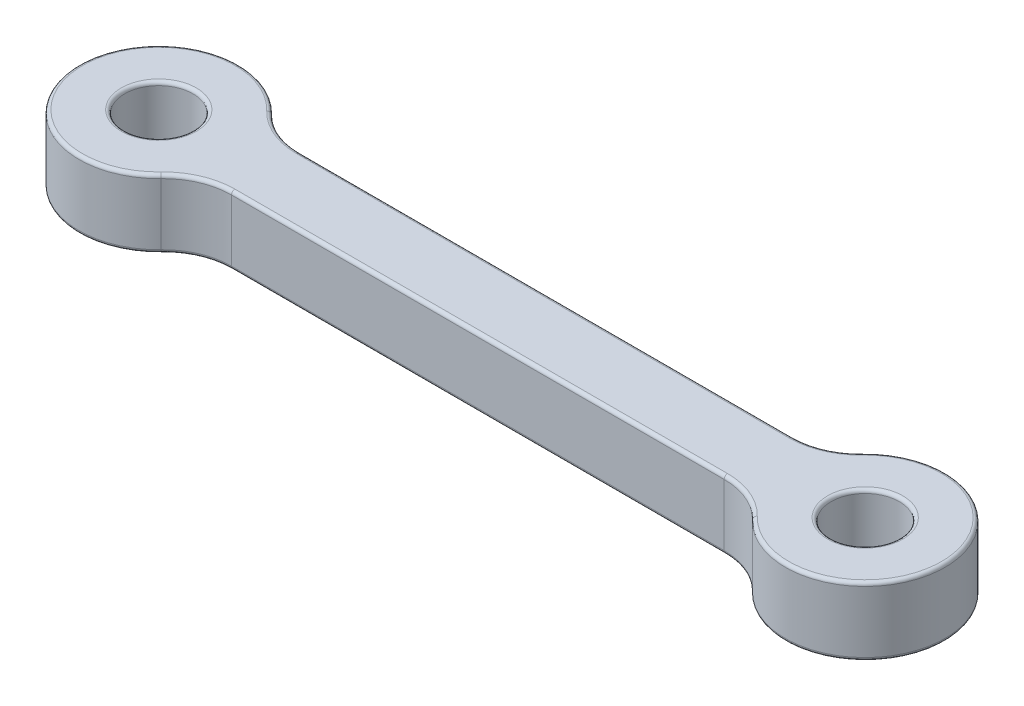
ISO-10303-21;
HEADER;
FILE_DESCRIPTION(('STEP AP214'),'2;1');
FILE_NAME('part.step','',(''),(''),'','','');
FILE_SCHEMA(('AUTOMOTIVE_DESIGN { 1 0 10303 214 1 1 1 1 }'));
ENDSEC;
DATA;
#1=APPLICATION_CONTEXT('core data for automotive mechanical design processes');
#2=APPLICATION_PROTOCOL_DEFINITION('international standard','automotive_design',2000,#1);
#3=PRODUCT_CONTEXT('',#1,'mechanical');
#4=PRODUCT('Part','Part','',(#3));
#5=PRODUCT_RELATED_PRODUCT_CATEGORY('part','',(#4));
#6=PRODUCT_DEFINITION_FORMATION('','',#4);
#7=PRODUCT_DEFINITION_CONTEXT('part definition',#1,'design');
#8=PRODUCT_DEFINITION('design','',#6,#7);
#9=PRODUCT_DEFINITION_SHAPE('','',#8);
#10=(LENGTH_UNIT() NAMED_UNIT(*) SI_UNIT(.MILLI.,.METRE.));
#11=(NAMED_UNIT(*) PLANE_ANGLE_UNIT() SI_UNIT($,.RADIAN.));
#12=(NAMED_UNIT(*) SI_UNIT($,.STERADIAN.) SOLID_ANGLE_UNIT());
#13=UNCERTAINTY_MEASURE_WITH_UNIT(LENGTH_MEASURE(1.E-05),#10,'distance_accuracy_value','');
#14=(GEOMETRIC_REPRESENTATION_CONTEXT(3) GLOBAL_UNCERTAINTY_ASSIGNED_CONTEXT((#13)) GLOBAL_UNIT_ASSIGNED_CONTEXT((#10,
#11,#12)) REPRESENTATION_CONTEXT('',''));
#15=CARTESIAN_POINT('',(0.,0.,0.));
#16=DIRECTION('',(0.,0.,1.));
#17=DIRECTION('',(1.,0.,0.));
#18=AXIS2_PLACEMENT_3D('',#15,#16,#17);
#19=CARTESIAN_POINT('',(-15.5,1.5,0.));
#20=DIRECTION('',(0.,-1.,0.));
#21=DIRECTION('',(0.,0.,-1.));
#22=AXIS2_PLACEMENT_3D('',#19,#20,#21);
#23=CYLINDRICAL_SURFACE('',#22,3.5);
#24=DIRECTION('',(0.,-1.,0.));
#25=VECTOR('',#24,1.);
#26=CARTESIAN_POINT('',(-12.9743915139412,1.5,-2.42307692307692));
#27=LINE('',#26,#25);
#28=CARTESIAN_POINT('',(-12.9743915139412,1.35,-2.42307692307692));
#29=VERTEX_POINT('',#28);
#30=CARTESIAN_POINT('',(-12.9743915139412,-1.35,-2.42307692307692));
#31=VERTEX_POINT('',#30);
#32=EDGE_CURVE('E354',#29,#31,#27,.T.);
#33=ORIENTED_EDGE('',*,*,#32,.T.);
#34=CARTESIAN_POINT('',(-15.5,-1.35,0.));
#35=DIRECTION('',(0.,1.,0.));
#36=DIRECTION('',(0.,0.,1.));
#37=AXIS2_PLACEMENT_3D('',#34,#35,#36);
#38=CIRCLE('',#37,3.5);
#39=CARTESIAN_POINT('',(-12.9743915139412,-1.35,2.42307692307692));
#40=VERTEX_POINT('',#39);
#41=EDGE_CURVE('E242',#31,#40,#38,.T.);
#42=ORIENTED_EDGE('',*,*,#41,.T.);
#43=DIRECTION('',(0.,-1.,0.));
#44=VECTOR('',#43,1.);
#45=CARTESIAN_POINT('',(-12.9743915139412,1.5,2.42307692307692));
#46=LINE('',#45,#44);
#47=CARTESIAN_POINT('',(-12.9743915139412,1.35,2.42307692307692));
#48=VERTEX_POINT('',#47);
#49=EDGE_CURVE('E302',#40,#48,#46,.F.);
#50=ORIENTED_EDGE('',*,*,#49,.T.);
#51=CARTESIAN_POINT('',(-15.5,1.35,0.));
#52=DIRECTION('',(0.,1.,0.));
#53=DIRECTION('',(0.,0.,1.));
#54=AXIS2_PLACEMENT_3D('',#51,#52,#53);
#55=CIRCLE('',#54,3.5);
#56=EDGE_CURVE('E239',#48,#29,#55,.F.);
#57=ORIENTED_EDGE('',*,*,#56,.T.);
#58=EDGE_LOOP('',(#33,#42,#50,#57));
#59=FACE_BOUND('',#58,.T.);
#60=ADVANCED_FACE('F41',(#59),#23,.T.);
#61=CARTESIAN_POINT('',(0.,1.5,1.5));
#62=DIRECTION('',(0.,0.,1.));
#63=DIRECTION('',(1.,0.,0.));
#64=AXIS2_PLACEMENT_3D('',#61,#62,#63);
#65=PLANE('',#64);
#66=DIRECTION('',(0.,-1.,0.));
#67=VECTOR('',#66,1.);
#68=CARTESIAN_POINT('',(-10.8095842401766,1.5,1.5));
#69=LINE('',#68,#67);
#70=CARTESIAN_POINT('',(-10.8095842401766,1.35,1.5));
#71=VERTEX_POINT('',#70);
#72=CARTESIAN_POINT('',(-10.8095842401766,-1.35,1.5));
#73=VERTEX_POINT('',#72);
#74=EDGE_CURVE('E349',#71,#73,#69,.T.);
#75=ORIENTED_EDGE('',*,*,#74,.T.);
#76=DIRECTION('',(-1.,0.,0.));
#77=VECTOR('',#76,1.);
#78=CARTESIAN_POINT('',(10.8095842401766,-1.35,1.5));
#79=LINE('',#78,#77);
#80=CARTESIAN_POINT('',(10.8095842401766,-1.35,1.5));
#81=VERTEX_POINT('',#80);
#82=EDGE_CURVE('E205',#73,#81,#79,.F.);
#83=ORIENTED_EDGE('',*,*,#82,.T.);
#84=DIRECTION('',(0.,1.,0.));
#85=VECTOR('',#84,1.);
#86=CARTESIAN_POINT('',(10.8095842401766,1.5,1.5));
#87=LINE('',#86,#85);
#88=CARTESIAN_POINT('',(10.8095842401766,1.35,1.5));
#89=VERTEX_POINT('',#88);
#90=EDGE_CURVE('E367',#81,#89,#87,.T.);
#91=ORIENTED_EDGE('',*,*,#90,.T.);
#92=DIRECTION('',(-1.,0.,0.));
#93=VECTOR('',#92,1.);
#94=CARTESIAN_POINT('',(0.,1.35,1.5));
#95=LINE('',#94,#93);
#96=EDGE_CURVE('E202',#89,#71,#95,.T.);
#97=ORIENTED_EDGE('',*,*,#96,.T.);
#98=EDGE_LOOP('',(#75,#83,#91,#97));
#99=FACE_BOUND('',#98,.T.);
#100=ADVANCED_FACE('F415',(#99),#65,.T.);
#101=CARTESIAN_POINT('',(15.5,1.5,0.));
#102=DIRECTION('',(0.,-1.,0.));
#103=DIRECTION('',(0.,0.,-1.));
#104=AXIS2_PLACEMENT_3D('',#101,#102,#103);
#105=CYLINDRICAL_SURFACE('',#104,3.5);
#106=DIRECTION('',(0.,-1.,0.));
#107=VECTOR('',#106,1.);
#108=CARTESIAN_POINT('',(12.9743915139412,1.5,2.42307692307692));
#109=LINE('',#108,#107);
#110=CARTESIAN_POINT('',(12.9743915139412,1.35,2.42307692307692));
#111=VERTEX_POINT('',#110);
#112=CARTESIAN_POINT('',(12.9743915139412,-1.35,2.42307692307692));
#113=VERTEX_POINT('',#112);
#114=EDGE_CURVE('E373',#111,#113,#109,.T.);
#115=ORIENTED_EDGE('',*,*,#114,.T.);
#116=CARTESIAN_POINT('',(15.5,-1.35,0.));
#117=DIRECTION('',(0.,1.,0.));
#118=DIRECTION('',(0.,0.,1.));
#119=AXIS2_PLACEMENT_3D('',#116,#117,#118);
#120=CIRCLE('',#119,3.5);
#121=CARTESIAN_POINT('',(12.9743915139412,-1.35,-2.42307692307692));
#122=VERTEX_POINT('',#121);
#123=EDGE_CURVE('E217',#113,#122,#120,.T.);
#124=ORIENTED_EDGE('',*,*,#123,.T.);
#125=DIRECTION('',(0.,-1.,0.));
#126=VECTOR('',#125,1.);
#127=CARTESIAN_POINT('',(12.9743915139412,1.5,-2.42307692307692));
#128=LINE('',#127,#126);
#129=CARTESIAN_POINT('',(12.9743915139412,1.35,-2.42307692307692));
#130=VERTEX_POINT('',#129);
#131=EDGE_CURVE('E377',#122,#130,#128,.F.);
#132=ORIENTED_EDGE('',*,*,#131,.T.);
#133=CARTESIAN_POINT('',(15.5,1.35,0.));
#134=DIRECTION('',(0.,1.,0.));
#135=DIRECTION('',(0.,0.,1.));
#136=AXIS2_PLACEMENT_3D('',#133,#134,#135);
#137=CIRCLE('',#136,3.5);
#138=EDGE_CURVE('E214',#130,#111,#137,.F.);
#139=ORIENTED_EDGE('',*,*,#138,.T.);
#140=EDGE_LOOP('',(#115,#124,#132,#139));
#141=FACE_BOUND('',#140,.T.);
#142=ADVANCED_FACE('F460',(#141),#105,.T.);
#143=CARTESIAN_POINT('',(0.,1.5,-1.5));
#144=DIRECTION('',(0.,0.,1.));
#145=DIRECTION('',(1.,0.,0.));
#146=AXIS2_PLACEMENT_3D('',#143,#144,#145);
#147=PLANE('',#146);
#148=DIRECTION('',(0.,-1.,0.));
#149=VECTOR('',#148,1.);
#150=CARTESIAN_POINT('',(10.8095842401766,1.5,-1.5));
#151=LINE('',#150,#149);
#152=CARTESIAN_POINT('',(10.8095842401766,1.35,-1.5));
#153=VERTEX_POINT('',#152);
#154=CARTESIAN_POINT('',(10.8095842401766,-1.35,-1.5));
#155=VERTEX_POINT('',#154);
#156=EDGE_CURVE('E357',#153,#155,#151,.T.);
#157=ORIENTED_EDGE('',*,*,#156,.T.);
#158=DIRECTION('',(-1.,0.,0.));
#159=VECTOR('',#158,1.);
#160=CARTESIAN_POINT('',(0.,-1.35,-1.5));
#161=LINE('',#160,#159);
#162=CARTESIAN_POINT('',(-10.8095842401766,-1.35,-1.5));
#163=VERTEX_POINT('',#162);
#164=EDGE_CURVE('E230',#155,#163,#161,.T.);
#165=ORIENTED_EDGE('',*,*,#164,.T.);
#166=DIRECTION('',(0.,1.,0.));
#167=VECTOR('',#166,1.);
#168=CARTESIAN_POINT('',(-10.8095842401766,1.5,-1.5));
#169=LINE('',#168,#167);
#170=CARTESIAN_POINT('',(-10.8095842401766,1.35,-1.5));
#171=VERTEX_POINT('',#170);
#172=EDGE_CURVE('E363',#163,#171,#169,.T.);
#173=ORIENTED_EDGE('',*,*,#172,.T.);
#174=DIRECTION('',(-1.,0.,0.));
#175=VECTOR('',#174,1.);
#176=CARTESIAN_POINT('',(10.8095842401766,1.35,-1.5));
#177=LINE('',#176,#175);
#178=EDGE_CURVE('E227',#171,#153,#177,.F.);
#179=ORIENTED_EDGE('',*,*,#178,.T.);
#180=EDGE_LOOP('',(#157,#165,#173,#179));
#181=FACE_BOUND('',#180,.T.);
#182=ADVANCED_FACE('F444',(#181),#147,.F.);
#183=CARTESIAN_POINT('',(-15.5,1.5,0.));
#184=DIRECTION('',(0.,-1.,0.));
#185=DIRECTION('',(0.,0.,-1.));
#186=AXIS2_PLACEMENT_3D('',#183,#184,#185);
#187=CYLINDRICAL_SURFACE('',#186,1.5);
#188=CARTESIAN_POINT('',(-15.5,-1.35,0.));
#189=DIRECTION('',(0.,1.,0.));
#190=DIRECTION('',(0.,0.,1.));
#191=AXIS2_PLACEMENT_3D('',#188,#189,#190);
#192=CIRCLE('',#191,1.5);
#193=CARTESIAN_POINT('',(-15.5,-1.35,1.5));
#194=VERTEX_POINT('',#193);
#195=EDGE_CURVE('E249',#194,#194,#192,.F.);
#196=ORIENTED_EDGE('',*,*,#195,.T.);
#197=EDGE_LOOP('',(#196));
#198=FACE_BOUND('',#197,.T.);
#199=CARTESIAN_POINT('',(-15.5,1.35,0.));
#200=DIRECTION('',(0.,1.,0.));
#201=DIRECTION('',(0.,0.,1.));
#202=AXIS2_PLACEMENT_3D('',#199,#200,#201);
#203=CIRCLE('',#202,1.5);
#204=CARTESIAN_POINT('',(-15.5,1.35,1.5));
#205=VERTEX_POINT('',#204);
#206=EDGE_CURVE('E245',#205,#205,#203,.T.);
#207=ORIENTED_EDGE('',*,*,#206,.T.);
#208=EDGE_LOOP('',(#207));
#209=FACE_BOUND('',#208,.T.);
#210=ADVANCED_FACE('F467',(#198,#209),#187,.F.);
#211=CARTESIAN_POINT('',(15.5,1.5,0.));
#212=DIRECTION('',(0.,-1.,0.));
#213=DIRECTION('',(0.,0.,-1.));
#214=AXIS2_PLACEMENT_3D('',#211,#212,#213);
#215=CYLINDRICAL_SURFACE('',#214,1.5);
#216=CARTESIAN_POINT('',(15.5,-1.35,0.));
#217=DIRECTION('',(0.,1.,0.));
#218=DIRECTION('',(0.,0.,1.));
#219=AXIS2_PLACEMENT_3D('',#216,#217,#218);
#220=CIRCLE('',#219,1.5);
#221=CARTESIAN_POINT('',(15.5,-1.35,1.5));
#222=VERTEX_POINT('',#221);
#223=EDGE_CURVE('E385',#222,#222,#220,.F.);
#224=ORIENTED_EDGE('',*,*,#223,.T.);
#225=EDGE_LOOP('',(#224));
#226=FACE_BOUND('',#225,.T.);
#227=CARTESIAN_POINT('',(15.5,1.35,0.));
#228=DIRECTION('',(0.,1.,0.));
#229=DIRECTION('',(0.,0.,1.));
#230=AXIS2_PLACEMENT_3D('',#227,#228,#229);
#231=CIRCLE('',#230,1.5);
#232=CARTESIAN_POINT('',(15.5,1.35,1.5));
#233=VERTEX_POINT('',#232);
#234=EDGE_CURVE('E381',#233,#233,#231,.T.);
#235=ORIENTED_EDGE('',*,*,#234,.T.);
#236=EDGE_LOOP('',(#235));
#237=FACE_BOUND('',#236,.T.);
#238=ADVANCED_FACE('F477',(#226,#237),#215,.F.);
#239=CARTESIAN_POINT('',(0.,1.5,0.));
#240=DIRECTION('',(0.,1.,0.));
#241=DIRECTION('',(0.,0.,1.));
#242=AXIS2_PLACEMENT_3D('',#239,#240,#241);
#243=PLANE('',#242);
#244=CARTESIAN_POINT('',(15.5,1.5,0.));
#245=DIRECTION('',(0.,1.,0.));
#246=DIRECTION('',(0.,0.,1.));
#247=AXIS2_PLACEMENT_3D('',#244,#245,#246);
#248=CIRCLE('',#247,1.65);
#249=CARTESIAN_POINT('',(15.5,1.5,1.65));
#250=VERTEX_POINT('',#249);
#251=EDGE_CURVE('E11',#250,#250,#248,.F.);
#252=ORIENTED_EDGE('',*,*,#251,.T.);
#253=EDGE_LOOP('',(#252));
#254=FACE_BOUND('',#253,.T.);
#255=CARTESIAN_POINT('',(15.5,1.5,0.));
#256=DIRECTION('',(0.,1.,0.));
#257=DIRECTION('',(0.,0.,1.));
#258=AXIS2_PLACEMENT_3D('',#255,#256,#257);
#259=CIRCLE('',#258,3.35);
#260=CARTESIAN_POINT('',(13.0826318776295,1.5,2.31923076923077));
#261=VERTEX_POINT('',#260);
#262=CARTESIAN_POINT('',(13.0826318776295,1.5,-2.31923076923077));
#263=VERTEX_POINT('',#262);
#264=EDGE_CURVE('E59',#261,#263,#259,.T.);
#265=ORIENTED_EDGE('',*,*,#264,.T.);
#266=CARTESIAN_POINT('',(10.8095842401766,1.5,-4.5));
#267=DIRECTION('',(0.,1.,0.));
#268=DIRECTION('',(0.,0.,1.));
#269=AXIS2_PLACEMENT_3D('',#266,#267,#268);
#270=CIRCLE('',#269,3.15);
#271=CARTESIAN_POINT('',(10.8095842401766,1.5,-1.35));
#272=VERTEX_POINT('',#271);
#273=EDGE_CURVE('E51',#263,#272,#270,.F.);
#274=ORIENTED_EDGE('',*,*,#273,.T.);
#275=DIRECTION('',(-1.,0.,0.));
#276=VECTOR('',#275,1.);
#277=CARTESIAN_POINT('',(-10.8095842401766,1.5,-1.35));
#278=LINE('',#277,#276);
#279=CARTESIAN_POINT('',(-10.8095842401766,1.5,-1.35));
#280=VERTEX_POINT('',#279);
#281=EDGE_CURVE('E257',#272,#280,#278,.T.);
#282=ORIENTED_EDGE('',*,*,#281,.T.);
#283=CARTESIAN_POINT('',(-10.8095842401766,1.5,-4.5));
#284=DIRECTION('',(0.,1.,0.));
#285=DIRECTION('',(0.,0.,1.));
#286=AXIS2_PLACEMENT_3D('',#283,#284,#285);
#287=CIRCLE('',#286,3.15);
#288=CARTESIAN_POINT('',(-13.0826318776295,1.5,-2.31923076923077));
#289=VERTEX_POINT('',#288);
#290=EDGE_CURVE('E260',#280,#289,#287,.F.);
#291=ORIENTED_EDGE('',*,*,#290,.T.);
#292=CARTESIAN_POINT('',(-15.5,1.5,0.));
#293=DIRECTION('',(0.,1.,0.));
#294=DIRECTION('',(0.,0.,1.));
#295=AXIS2_PLACEMENT_3D('',#292,#293,#294);
#296=CIRCLE('',#295,3.35);
#297=CARTESIAN_POINT('',(-13.0826318776295,1.5,2.31923076923077));
#298=VERTEX_POINT('',#297);
#299=EDGE_CURVE('E263',#289,#298,#296,.T.);
#300=ORIENTED_EDGE('',*,*,#299,.T.);
#301=CARTESIAN_POINT('',(-10.8095842401766,1.5,4.5));
#302=DIRECTION('',(0.,1.,0.));
#303=DIRECTION('',(0.,0.,1.));
#304=AXIS2_PLACEMENT_3D('',#301,#302,#303);
#305=CIRCLE('',#304,3.15);
#306=CARTESIAN_POINT('',(-10.8095842401766,1.5,1.35));
#307=VERTEX_POINT('',#306);
#308=EDGE_CURVE('E266',#298,#307,#305,.F.);
#309=ORIENTED_EDGE('',*,*,#308,.T.);
#310=DIRECTION('',(-1.,0.,0.));
#311=VECTOR('',#310,1.);
#312=CARTESIAN_POINT('',(0.,1.5,1.35));
#313=LINE('',#312,#311);
#314=CARTESIAN_POINT('',(10.8095842401766,1.5,1.35));
#315=VERTEX_POINT('',#314);
#316=EDGE_CURVE('E269',#307,#315,#313,.F.);
#317=ORIENTED_EDGE('',*,*,#316,.T.);
#318=CARTESIAN_POINT('',(10.8095842401766,1.5,4.5));
#319=DIRECTION('',(0.,1.,0.));
#320=DIRECTION('',(0.,0.,1.));
#321=AXIS2_PLACEMENT_3D('',#318,#319,#320);
#322=CIRCLE('',#321,3.15);
#323=EDGE_CURVE('E64',#315,#261,#322,.F.);
#324=ORIENTED_EDGE('',*,*,#323,.T.);
#325=EDGE_LOOP('',(#265,#274,#282,#291,#300,#309,#317,#324));
#326=FACE_BOUND('',#325,.T.);
#327=CARTESIAN_POINT('',(-15.5,1.5,0.));
#328=DIRECTION('',(0.,1.,0.));
#329=DIRECTION('',(0.,0.,1.));
#330=AXIS2_PLACEMENT_3D('',#327,#328,#329);
#331=CIRCLE('',#330,1.65);
#332=CARTESIAN_POINT('',(-15.5,1.5,1.65));
#333=VERTEX_POINT('',#332);
#334=EDGE_CURVE('E253',#333,#333,#331,.F.);
#335=ORIENTED_EDGE('',*,*,#334,.T.);
#336=EDGE_LOOP('',(#335));
#337=FACE_BOUND('',#336,.T.);
#338=ADVANCED_FACE('F431',(#254,#326,#337),#243,.T.);
#339=CARTESIAN_POINT('',(0.,-1.5,0.));
#340=DIRECTION('',(0.,1.,0.));
#341=DIRECTION('',(0.,0.,1.));
#342=AXIS2_PLACEMENT_3D('',#339,#340,#341);
#343=PLANE('',#342);
#344=CARTESIAN_POINT('',(15.5,-1.5,0.));
#345=DIRECTION('',(0.,1.,0.));
#346=DIRECTION('',(0.,0.,1.));
#347=AXIS2_PLACEMENT_3D('',#344,#345,#346);
#348=CIRCLE('',#347,1.65);
#349=CARTESIAN_POINT('',(15.5,-1.5,1.65));
#350=VERTEX_POINT('',#349);
#351=EDGE_CURVE('E187',#350,#350,#348,.T.);
#352=ORIENTED_EDGE('',*,*,#351,.T.);
#353=EDGE_LOOP('',(#352));
#354=FACE_BOUND('',#353,.T.);
#355=DIRECTION('',(-1.,0.,0.));
#356=VECTOR('',#355,1.);
#357=CARTESIAN_POINT('',(-10.8095842401766,-1.5,1.35));
#358=LINE('',#357,#356);
#359=CARTESIAN_POINT('',(10.8095842401766,-1.5,1.35));
#360=VERTEX_POINT('',#359);
#361=CARTESIAN_POINT('',(-10.8095842401766,-1.5,1.35));
#362=VERTEX_POINT('',#361);
#363=EDGE_CURVE('E184',#360,#362,#358,.T.);
#364=ORIENTED_EDGE('',*,*,#363,.T.);
#365=CARTESIAN_POINT('',(-10.8095842401766,-1.5,4.5));
#366=DIRECTION('',(0.,1.,0.));
#367=DIRECTION('',(0.,0.,1.));
#368=AXIS2_PLACEMENT_3D('',#365,#366,#367);
#369=CIRCLE('',#368,3.15);
#370=CARTESIAN_POINT('',(-13.0826318776295,-1.5,2.31923076923077));
#371=VERTEX_POINT('',#370);
#372=EDGE_CURVE('E162',#362,#371,#369,.T.);
#373=ORIENTED_EDGE('',*,*,#372,.T.);
#374=CARTESIAN_POINT('',(-15.5,-1.5,0.));
#375=DIRECTION('',(0.,1.,0.));
#376=DIRECTION('',(0.,0.,1.));
#377=AXIS2_PLACEMENT_3D('',#374,#375,#376);
#378=CIRCLE('',#377,3.35);
#379=CARTESIAN_POINT('',(-13.0826318776295,-1.5,-2.31923076923077));
#380=VERTEX_POINT('',#379);
#381=EDGE_CURVE('E171',#371,#380,#378,.F.);
#382=ORIENTED_EDGE('',*,*,#381,.T.);
#383=CARTESIAN_POINT('',(-10.8095842401766,-1.5,-4.5));
#384=DIRECTION('',(0.,1.,0.));
#385=DIRECTION('',(0.,0.,1.));
#386=AXIS2_PLACEMENT_3D('',#383,#384,#385);
#387=CIRCLE('',#386,3.15);
#388=CARTESIAN_POINT('',(-10.8095842401766,-1.5,-1.35));
#389=VERTEX_POINT('',#388);
#390=EDGE_CURVE('E178',#380,#389,#387,.T.);
#391=ORIENTED_EDGE('',*,*,#390,.T.);
#392=DIRECTION('',(-1.,0.,0.));
#393=VECTOR('',#392,1.);
#394=CARTESIAN_POINT('',(0.,-1.5,-1.35));
#395=LINE('',#394,#393);
#396=CARTESIAN_POINT('',(10.8095842401766,-1.5,-1.35));
#397=VERTEX_POINT('',#396);
#398=EDGE_CURVE('E394',#389,#397,#395,.F.);
#399=ORIENTED_EDGE('',*,*,#398,.T.);
#400=CARTESIAN_POINT('',(10.8095842401766,-1.5,-4.5));
#401=DIRECTION('',(0.,1.,0.));
#402=DIRECTION('',(0.,0.,1.));
#403=AXIS2_PLACEMENT_3D('',#400,#401,#402);
#404=CIRCLE('',#403,3.15);
#405=CARTESIAN_POINT('',(13.0826318776295,-1.5,-2.31923076923077));
#406=VERTEX_POINT('',#405);
#407=EDGE_CURVE('E397',#397,#406,#404,.T.);
#408=ORIENTED_EDGE('',*,*,#407,.T.);
#409=CARTESIAN_POINT('',(15.5,-1.5,0.));
#410=DIRECTION('',(0.,1.,0.));
#411=DIRECTION('',(0.,0.,1.));
#412=AXIS2_PLACEMENT_3D('',#409,#410,#411);
#413=CIRCLE('',#412,3.35);
#414=CARTESIAN_POINT('',(13.0826318776295,-1.5,2.31923076923077));
#415=VERTEX_POINT('',#414);
#416=EDGE_CURVE('E400',#406,#415,#413,.F.);
#417=ORIENTED_EDGE('',*,*,#416,.T.);
#418=CARTESIAN_POINT('',(10.8095842401766,-1.5,4.5));
#419=DIRECTION('',(0.,1.,0.));
#420=DIRECTION('',(0.,0.,1.));
#421=AXIS2_PLACEMENT_3D('',#418,#419,#420);
#422=CIRCLE('',#421,3.15);
#423=EDGE_CURVE('E194',#415,#360,#422,.T.);
#424=ORIENTED_EDGE('',*,*,#423,.T.);
#425=EDGE_LOOP('',(#364,#373,#382,#391,#399,#408,#417,#424));
#426=FACE_BOUND('',#425,.T.);
#427=CARTESIAN_POINT('',(-15.5,-1.5,0.));
#428=DIRECTION('',(0.,1.,0.));
#429=DIRECTION('',(0.,0.,1.));
#430=AXIS2_PLACEMENT_3D('',#427,#428,#429);
#431=CIRCLE('',#430,1.65);
#432=CARTESIAN_POINT('',(-15.5,-1.5,1.65));
#433=VERTEX_POINT('',#432);
#434=EDGE_CURVE('E179',#433,#433,#431,.T.);
#435=ORIENTED_EDGE('',*,*,#434,.T.);
#436=EDGE_LOOP('',(#435));
#437=FACE_BOUND('',#436,.T.);
#438=ADVANCED_FACE('F181',(#354,#426,#437),#343,.F.);
#439=CARTESIAN_POINT('',(-10.8095842401766,1.5,-4.5));
#440=DIRECTION('',(0.,-1.,0.));
#441=DIRECTION('',(0.,0.,-1.));
#442=AXIS2_PLACEMENT_3D('',#439,#440,#441);
#443=CYLINDRICAL_SURFACE('',#442,3.);
#444=ORIENTED_EDGE('',*,*,#172,.F.);
#445=CARTESIAN_POINT('',(-10.8095842401766,-1.35,-4.5));
#446=DIRECTION('',(0.,1.,0.));
#447=DIRECTION('',(0.,0.,1.));
#448=AXIS2_PLACEMENT_3D('',#445,#446,#447);
#449=CIRCLE('',#448,3.);
#450=EDGE_CURVE('E236',#163,#31,#449,.F.);
#451=ORIENTED_EDGE('',*,*,#450,.T.);
#452=ORIENTED_EDGE('',*,*,#32,.F.);
#453=CARTESIAN_POINT('',(-10.8095842401766,1.35,-4.5));
#454=DIRECTION('',(0.,1.,0.));
#455=DIRECTION('',(0.,0.,1.));
#456=AXIS2_PLACEMENT_3D('',#453,#454,#455);
#457=CIRCLE('',#456,3.);
#458=EDGE_CURVE('E233',#29,#171,#457,.T.);
#459=ORIENTED_EDGE('',*,*,#458,.T.);
#460=EDGE_LOOP('',(#444,#451,#452,#459));
#461=FACE_BOUND('',#460,.T.);
#462=ADVANCED_FACE('F479',(#461),#443,.F.);
#463=CARTESIAN_POINT('',(-10.8095842401766,1.5,4.5));
#464=DIRECTION('',(0.,-1.,0.));
#465=DIRECTION('',(0.,0.,-1.));
#466=AXIS2_PLACEMENT_3D('',#463,#464,#465);
#467=CYLINDRICAL_SURFACE('',#466,3.);
#468=ORIENTED_EDGE('',*,*,#49,.F.);
#469=CARTESIAN_POINT('',(-10.8095842401766,-1.35,4.5));
#470=DIRECTION('',(0.,1.,0.));
#471=DIRECTION('',(0.,0.,1.));
#472=AXIS2_PLACEMENT_3D('',#469,#470,#471);
#473=CIRCLE('',#472,3.);
#474=EDGE_CURVE('E164',#40,#73,#473,.F.);
#475=ORIENTED_EDGE('',*,*,#474,.T.);
#476=ORIENTED_EDGE('',*,*,#74,.F.);
#477=CARTESIAN_POINT('',(-10.8095842401766,1.35,4.5));
#478=DIRECTION('',(0.,1.,0.));
#479=DIRECTION('',(0.,0.,1.));
#480=AXIS2_PLACEMENT_3D('',#477,#478,#479);
#481=CIRCLE('',#480,3.);
#482=EDGE_CURVE('E192',#71,#48,#481,.T.);
#483=ORIENTED_EDGE('',*,*,#482,.T.);
#484=EDGE_LOOP('',(#468,#475,#476,#483));
#485=FACE_BOUND('',#484,.T.);
#486=ADVANCED_FACE('F347',(#485),#467,.F.);
#487=CARTESIAN_POINT('',(10.8095842401766,1.5,-4.5));
#488=DIRECTION('',(0.,-1.,0.));
#489=DIRECTION('',(0.,0.,-1.));
#490=AXIS2_PLACEMENT_3D('',#487,#488,#489);
#491=CYLINDRICAL_SURFACE('',#490,3.);
#492=ORIENTED_EDGE('',*,*,#131,.F.);
#493=CARTESIAN_POINT('',(10.8095842401766,-1.35,-4.5));
#494=DIRECTION('',(0.,1.,0.));
#495=DIRECTION('',(0.,0.,1.));
#496=AXIS2_PLACEMENT_3D('',#493,#494,#495);
#497=CIRCLE('',#496,3.);
#498=EDGE_CURVE('E224',#122,#155,#497,.F.);
#499=ORIENTED_EDGE('',*,*,#498,.T.);
#500=ORIENTED_EDGE('',*,*,#156,.F.);
#501=CARTESIAN_POINT('',(10.8095842401766,1.35,-4.5));
#502=DIRECTION('',(0.,1.,0.));
#503=DIRECTION('',(0.,0.,1.));
#504=AXIS2_PLACEMENT_3D('',#501,#502,#503);
#505=CIRCLE('',#504,3.);
#506=EDGE_CURVE('E220',#153,#130,#505,.T.);
#507=ORIENTED_EDGE('',*,*,#506,.T.);
#508=EDGE_LOOP('',(#492,#499,#500,#507));
#509=FACE_BOUND('',#508,.T.);
#510=ADVANCED_FACE('F449',(#509),#491,.F.);
#511=CARTESIAN_POINT('',(10.8095842401766,1.5,4.5));
#512=DIRECTION('',(0.,-1.,0.));
#513=DIRECTION('',(0.,0.,-1.));
#514=AXIS2_PLACEMENT_3D('',#511,#512,#513);
#515=CYLINDRICAL_SURFACE('',#514,3.);
#516=ORIENTED_EDGE('',*,*,#90,.F.);
#517=CARTESIAN_POINT('',(10.8095842401766,-1.35,4.5));
#518=DIRECTION('',(0.,1.,0.));
#519=DIRECTION('',(0.,0.,1.));
#520=AXIS2_PLACEMENT_3D('',#517,#518,#519);
#521=CIRCLE('',#520,3.);
#522=EDGE_CURVE('E211',#81,#113,#521,.F.);
#523=ORIENTED_EDGE('',*,*,#522,.T.);
#524=ORIENTED_EDGE('',*,*,#114,.F.);
#525=CARTESIAN_POINT('',(10.8095842401766,1.35,4.5));
#526=DIRECTION('',(0.,1.,0.));
#527=DIRECTION('',(0.,0.,1.));
#528=AXIS2_PLACEMENT_3D('',#525,#526,#527);
#529=CIRCLE('',#528,3.);
#530=EDGE_CURVE('E208',#111,#89,#529,.T.);
#531=ORIENTED_EDGE('',*,*,#530,.T.);
#532=EDGE_LOOP('',(#516,#523,#524,#531));
#533=FACE_BOUND('',#532,.T.);
#534=ADVANCED_FACE('F417',(#533),#515,.F.);
#535=CARTESIAN_POINT('',(15.5,-1.35,0.));
#536=DIRECTION('',(0.,1.,0.));
#537=DIRECTION('',(0.,0.,1.));
#538=AXIS2_PLACEMENT_3D('',#535,#536,#537);
#539=TOROIDAL_SURFACE('',#538,1.65,0.15);
#540=ORIENTED_EDGE('',*,*,#351,.F.);
#541=EDGE_LOOP('',(#540));
#542=FACE_BOUND('',#541,.T.);
#543=ORIENTED_EDGE('',*,*,#223,.F.);
#544=EDGE_LOOP('',(#543));
#545=FACE_BOUND('',#544,.T.);
#546=ADVANCED_FACE('F489',(#542,#545),#539,.T.);
#547=CARTESIAN_POINT('',(10.8095842401766,-1.35,-4.5));
#548=DIRECTION('',(0.,1.,0.));
#549=DIRECTION('',(0.,0.,1.));
#550=AXIS2_PLACEMENT_3D('',#547,#548,#549);
#551=TOROIDAL_SURFACE('',#550,3.15,0.15);
#552=CARTESIAN_POINT('',(10.8095842401766,-1.35,-1.35));
#553=DIRECTION('',(-1.,0.,0.));
#554=DIRECTION('',(0.,0.,1.));
#555=AXIS2_PLACEMENT_3D('',#552,#553,#554);
#556=CIRCLE('',#555,0.15);
#557=EDGE_CURVE('E294',#155,#397,#556,.T.);
#558=ORIENTED_EDGE('',*,*,#557,.F.);
#559=ORIENTED_EDGE('',*,*,#498,.F.);
#560=CARTESIAN_POINT('',(13.0826318776295,-1.35,-2.31923076923077));
#561=DIRECTION('',(0.692307692307691,0.,-0.721602424588221));
#562=DIRECTION('',(-0.721602424588221,0.,-0.692307692307691));
#563=AXIS2_PLACEMENT_3D('',#560,#561,#562);
#564=CIRCLE('',#563,0.15);
#565=EDGE_CURVE('E298',#406,#122,#564,.T.);
#566=ORIENTED_EDGE('',*,*,#565,.F.);
#567=ORIENTED_EDGE('',*,*,#407,.F.);
#568=EDGE_LOOP('',(#558,#559,#566,#567));
#569=FACE_BOUND('',#568,.T.);
#570=ADVANCED_FACE('F453',(#569),#551,.T.);
#571=CARTESIAN_POINT('',(15.5,-1.35,0.));
#572=DIRECTION('',(0.,1.,0.));
#573=DIRECTION('',(0.,0.,1.));
#574=AXIS2_PLACEMENT_3D('',#571,#572,#573);
#575=TOROIDAL_SURFACE('',#574,3.35,0.15);
#576=ORIENTED_EDGE('',*,*,#565,.T.);
#577=ORIENTED_EDGE('',*,*,#123,.F.);
#578=CARTESIAN_POINT('',(13.0826318776295,-1.35,2.31923076923077));
#579=DIRECTION('',(-0.69230769230769,0.,-0.721602424588222));
#580=DIRECTION('',(-0.721602424588222,0.,0.69230769230769));
#581=AXIS2_PLACEMENT_3D('',#578,#579,#580);
#582=CIRCLE('',#581,0.15);
#583=EDGE_CURVE('E290',#415,#113,#582,.T.);
#584=ORIENTED_EDGE('',*,*,#583,.F.);
#585=ORIENTED_EDGE('',*,*,#416,.F.);
#586=EDGE_LOOP('',(#576,#577,#584,#585));
#587=FACE_BOUND('',#586,.T.);
#588=ADVANCED_FACE('F458',(#587),#575,.T.);
#589=CARTESIAN_POINT('',(0.,-1.35,-1.35));
#590=DIRECTION('',(-1.,0.,0.));
#591=DIRECTION('',(0.,0.,1.));
#592=AXIS2_PLACEMENT_3D('',#589,#590,#591);
#593=CYLINDRICAL_SURFACE('',#592,0.15);
#594=ORIENTED_EDGE('',*,*,#557,.T.);
#595=ORIENTED_EDGE('',*,*,#398,.F.);
#596=CARTESIAN_POINT('',(-10.8095842401766,-1.35,-1.35));
#597=DIRECTION('',(-1.,0.,0.));
#598=DIRECTION('',(0.,0.,1.));
#599=AXIS2_PLACEMENT_3D('',#596,#597,#598);
#600=CIRCLE('',#599,0.15);
#601=EDGE_CURVE('E286',#163,#389,#600,.T.);
#602=ORIENTED_EDGE('',*,*,#601,.F.);
#603=ORIENTED_EDGE('',*,*,#164,.F.);
#604=EDGE_LOOP('',(#594,#595,#602,#603));
#605=FACE_BOUND('',#604,.T.);
#606=ADVANCED_FACE('F506',(#605),#593,.T.);
#607=CARTESIAN_POINT('',(10.8095842401766,-1.35,4.5));
#608=DIRECTION('',(0.,1.,0.));
#609=DIRECTION('',(0.,0.,1.));
#610=AXIS2_PLACEMENT_3D('',#607,#608,#609);
#611=TOROIDAL_SURFACE('',#610,3.15,0.15);
#612=ORIENTED_EDGE('',*,*,#583,.T.);
#613=ORIENTED_EDGE('',*,*,#522,.F.);
#614=CARTESIAN_POINT('',(10.8095842401766,-1.35,1.35));
#615=DIRECTION('',(-1.,0.,0.));
#616=DIRECTION('',(0.,0.,1.));
#617=AXIS2_PLACEMENT_3D('',#614,#615,#616);
#618=CIRCLE('',#617,0.15);
#619=EDGE_CURVE('E282',#360,#81,#618,.T.);
#620=ORIENTED_EDGE('',*,*,#619,.F.);
#621=ORIENTED_EDGE('',*,*,#423,.F.);
#622=EDGE_LOOP('',(#612,#613,#620,#621));
#623=FACE_BOUND('',#622,.T.);
#624=ADVANCED_FACE('F409',(#623),#611,.T.);
#625=CARTESIAN_POINT('',(-10.8095842401766,-1.35,-4.5));
#626=DIRECTION('',(0.,1.,0.));
#627=DIRECTION('',(0.,0.,1.));
#628=AXIS2_PLACEMENT_3D('',#625,#626,#627);
#629=TOROIDAL_SURFACE('',#628,3.15,0.15);
#630=ORIENTED_EDGE('',*,*,#601,.T.);
#631=ORIENTED_EDGE('',*,*,#390,.F.);
#632=CARTESIAN_POINT('',(-13.0826318776295,-1.35,-2.31923076923077));
#633=DIRECTION('',(-0.692307692307691,0.,-0.721602424588221));
#634=DIRECTION('',(-0.721602424588221,0.,0.692307692307691));
#635=AXIS2_PLACEMENT_3D('',#632,#633,#634);
#636=CIRCLE('',#635,0.15);
#637=EDGE_CURVE('E174',#31,#380,#636,.T.);
#638=ORIENTED_EDGE('',*,*,#637,.F.);
#639=ORIENTED_EDGE('',*,*,#450,.F.);
#640=EDGE_LOOP('',(#630,#631,#638,#639));
#641=FACE_BOUND('',#640,.T.);
#642=ADVANCED_FACE('F500',(#641),#629,.T.);
#643=CARTESIAN_POINT('',(0.,-1.35,1.35));
#644=DIRECTION('',(1.,0.,0.));
#645=DIRECTION('',(0.,0.,-1.));
#646=AXIS2_PLACEMENT_3D('',#643,#644,#645);
#647=CYLINDRICAL_SURFACE('',#646,0.15);
#648=ORIENTED_EDGE('',*,*,#619,.T.);
#649=ORIENTED_EDGE('',*,*,#82,.F.);
#650=CARTESIAN_POINT('',(-10.8095842401766,-1.35,1.35));
#651=DIRECTION('',(-1.,0.,0.));
#652=DIRECTION('',(0.,0.,1.));
#653=AXIS2_PLACEMENT_3D('',#650,#651,#652);
#654=CIRCLE('',#653,0.15);
#655=EDGE_CURVE('E168',#362,#73,#654,.T.);
#656=ORIENTED_EDGE('',*,*,#655,.F.);
#657=ORIENTED_EDGE('',*,*,#363,.F.);
#658=EDGE_LOOP('',(#648,#649,#656,#657));
#659=FACE_BOUND('',#658,.T.);
#660=ADVANCED_FACE('F412',(#659),#647,.T.);
#661=CARTESIAN_POINT('',(-15.5,-1.35,0.));
#662=DIRECTION('',(0.,1.,0.));
#663=DIRECTION('',(0.,0.,1.));
#664=AXIS2_PLACEMENT_3D('',#661,#662,#663);
#665=TOROIDAL_SURFACE('',#664,3.35,0.15);
#666=ORIENTED_EDGE('',*,*,#637,.T.);
#667=ORIENTED_EDGE('',*,*,#381,.F.);
#668=CARTESIAN_POINT('',(-13.0826318776295,-1.35,2.31923076923077));
#669=DIRECTION('',(0.692307692307691,0.,-0.721602424588221));
#670=DIRECTION('',(-0.721602424588221,0.,-0.692307692307691));
#671=AXIS2_PLACEMENT_3D('',#668,#669,#670);
#672=CIRCLE('',#671,0.15);
#673=EDGE_CURVE('E158',#40,#371,#672,.T.);
#674=ORIENTED_EDGE('',*,*,#673,.F.);
#675=ORIENTED_EDGE('',*,*,#41,.F.);
#676=EDGE_LOOP('',(#666,#667,#674,#675));
#677=FACE_BOUND('',#676,.T.);
#678=ADVANCED_FACE('F172',(#677),#665,.T.);
#679=CARTESIAN_POINT('',(-10.8095842401766,-1.35,4.5));
#680=DIRECTION('',(0.,1.,0.));
#681=DIRECTION('',(0.,0.,1.));
#682=AXIS2_PLACEMENT_3D('',#679,#680,#681);
#683=TOROIDAL_SURFACE('',#682,3.15,0.15);
#684=ORIENTED_EDGE('',*,*,#655,.T.);
#685=ORIENTED_EDGE('',*,*,#474,.F.);
#686=ORIENTED_EDGE('',*,*,#673,.T.);
#687=ORIENTED_EDGE('',*,*,#372,.F.);
#688=EDGE_LOOP('',(#684,#685,#686,#687));
#689=FACE_BOUND('',#688,.T.);
#690=ADVANCED_FACE('F160',(#689),#683,.T.);
#691=CARTESIAN_POINT('',(-15.5,-1.35,0.));
#692=DIRECTION('',(0.,1.,0.));
#693=DIRECTION('',(0.,0.,1.));
#694=AXIS2_PLACEMENT_3D('',#691,#692,#693);
#695=TOROIDAL_SURFACE('',#694,1.65,0.15);
#696=ORIENTED_EDGE('',*,*,#195,.F.);
#697=EDGE_LOOP('',(#696));
#698=FACE_BOUND('',#697,.T.);
#699=ORIENTED_EDGE('',*,*,#434,.F.);
#700=EDGE_LOOP('',(#699));
#701=FACE_BOUND('',#700,.T.);
#702=ADVANCED_FACE('F495',(#698,#701),#695,.T.);
#703=CARTESIAN_POINT('',(15.5,1.35,0.));
#704=DIRECTION('',(0.,1.,0.));
#705=DIRECTION('',(0.,0.,1.));
#706=AXIS2_PLACEMENT_3D('',#703,#704,#705);
#707=TOROIDAL_SURFACE('',#706,1.65,0.15);
#708=ORIENTED_EDGE('',*,*,#234,.F.);
#709=EDGE_LOOP('',(#708));
#710=FACE_BOUND('',#709,.T.);
#711=ORIENTED_EDGE('',*,*,#251,.F.);
#712=EDGE_LOOP('',(#711));
#713=FACE_BOUND('',#712,.T.);
#714=ADVANCED_FACE('F516',(#710,#713),#707,.T.);
#715=CARTESIAN_POINT('',(-10.8095842401766,1.35,4.5));
#716=DIRECTION('',(0.,1.,0.));
#717=DIRECTION('',(0.,0.,1.));
#718=AXIS2_PLACEMENT_3D('',#715,#716,#717);
#719=TOROIDAL_SURFACE('',#718,3.15,0.15);
#720=CARTESIAN_POINT('',(-13.0826318776295,1.35,2.31923076923077));
#721=DIRECTION('',(-0.692307692307691,0.,0.721602424588221));
#722=DIRECTION('',(0.721602424588221,0.,0.692307692307691));
#723=AXIS2_PLACEMENT_3D('',#720,#721,#722);
#724=CIRCLE('',#723,0.15);
#725=EDGE_CURVE('E324',#48,#298,#724,.T.);
#726=ORIENTED_EDGE('',*,*,#725,.F.);
#727=ORIENTED_EDGE('',*,*,#482,.F.);
#728=CARTESIAN_POINT('',(-10.8095842401766,1.35,1.35));
#729=DIRECTION('',(1.,0.,0.));
#730=DIRECTION('',(0.,0.,-1.));
#731=AXIS2_PLACEMENT_3D('',#728,#729,#730);
#732=CIRCLE('',#731,0.15);
#733=EDGE_CURVE('E45',#307,#71,#732,.T.);
#734=ORIENTED_EDGE('',*,*,#733,.F.);
#735=ORIENTED_EDGE('',*,*,#308,.F.);
#736=EDGE_LOOP('',(#726,#727,#734,#735));
#737=FACE_BOUND('',#736,.T.);
#738=ADVANCED_FACE('F342',(#737),#719,.T.);
#739=CARTESIAN_POINT('',(0.,1.35,1.35));
#740=DIRECTION('',(-1.,0.,0.));
#741=DIRECTION('',(0.,0.,1.));
#742=AXIS2_PLACEMENT_3D('',#739,#740,#741);
#743=CYLINDRICAL_SURFACE('',#742,0.15);
#744=ORIENTED_EDGE('',*,*,#733,.T.);
#745=ORIENTED_EDGE('',*,*,#96,.F.);
#746=CARTESIAN_POINT('',(10.8095842401766,1.35,1.35));
#747=DIRECTION('',(1.,0.,0.));
#748=DIRECTION('',(0.,0.,-1.));
#749=AXIS2_PLACEMENT_3D('',#746,#747,#748);
#750=CIRCLE('',#749,0.15);
#751=EDGE_CURVE('E321',#315,#89,#750,.T.);
#752=ORIENTED_EDGE('',*,*,#751,.F.);
#753=ORIENTED_EDGE('',*,*,#316,.F.);
#754=EDGE_LOOP('',(#744,#745,#752,#753));
#755=FACE_BOUND('',#754,.T.);
#756=ADVANCED_FACE('F337',(#755),#743,.T.);
#757=CARTESIAN_POINT('',(-15.5,1.35,0.));
#758=DIRECTION('',(0.,1.,0.));
#759=DIRECTION('',(0.,0.,1.));
#760=AXIS2_PLACEMENT_3D('',#757,#758,#759);
#761=TOROIDAL_SURFACE('',#760,3.35,0.15);
#762=ORIENTED_EDGE('',*,*,#725,.T.);
#763=ORIENTED_EDGE('',*,*,#299,.F.);
#764=CARTESIAN_POINT('',(-13.0826318776295,1.35,-2.31923076923077));
#765=DIRECTION('',(0.692307692307691,0.,0.721602424588221));
#766=DIRECTION('',(0.721602424588221,0.,-0.692307692307691));
#767=AXIS2_PLACEMENT_3D('',#764,#765,#766);
#768=CIRCLE('',#767,0.15);
#769=EDGE_CURVE('E317',#29,#289,#768,.T.);
#770=ORIENTED_EDGE('',*,*,#769,.F.);
#771=ORIENTED_EDGE('',*,*,#56,.F.);
#772=EDGE_LOOP('',(#762,#763,#770,#771));
#773=FACE_BOUND('',#772,.T.);
#774=ADVANCED_FACE('F531',(#773),#761,.T.);
#775=CARTESIAN_POINT('',(10.8095842401766,1.35,4.5));
#776=DIRECTION('',(0.,1.,0.));
#777=DIRECTION('',(0.,0.,1.));
#778=AXIS2_PLACEMENT_3D('',#775,#776,#777);
#779=TOROIDAL_SURFACE('',#778,3.15,0.15);
#780=ORIENTED_EDGE('',*,*,#751,.T.);
#781=ORIENTED_EDGE('',*,*,#530,.F.);
#782=CARTESIAN_POINT('',(13.0826318776295,1.35,2.31923076923077));
#783=DIRECTION('',(0.692307692307691,0.,0.721602424588221));
#784=DIRECTION('',(0.721602424588221,0.,-0.692307692307691));
#785=AXIS2_PLACEMENT_3D('',#782,#783,#784);
#786=CIRCLE('',#785,0.15);
#787=EDGE_CURVE('E313',#261,#111,#786,.T.);
#788=ORIENTED_EDGE('',*,*,#787,.F.);
#789=ORIENTED_EDGE('',*,*,#323,.F.);
#790=EDGE_LOOP('',(#780,#781,#788,#789));
#791=FACE_BOUND('',#790,.T.);
#792=ADVANCED_FACE('F421',(#791),#779,.T.);
#793=CARTESIAN_POINT('',(-10.8095842401766,1.35,-4.5));
#794=DIRECTION('',(0.,1.,0.));
#795=DIRECTION('',(0.,0.,1.));
#796=AXIS2_PLACEMENT_3D('',#793,#794,#795);
#797=TOROIDAL_SURFACE('',#796,3.15,0.15);
#798=ORIENTED_EDGE('',*,*,#769,.T.);
#799=ORIENTED_EDGE('',*,*,#290,.F.);
#800=CARTESIAN_POINT('',(-10.8095842401766,1.35,-1.35));
#801=DIRECTION('',(1.,0.,0.));
#802=DIRECTION('',(0.,0.,-1.));
#803=AXIS2_PLACEMENT_3D('',#800,#801,#802);
#804=CIRCLE('',#803,0.15);
#805=EDGE_CURVE('E309',#171,#280,#804,.T.);
#806=ORIENTED_EDGE('',*,*,#805,.F.);
#807=ORIENTED_EDGE('',*,*,#458,.F.);
#808=EDGE_LOOP('',(#798,#799,#806,#807));
#809=FACE_BOUND('',#808,.T.);
#810=ADVANCED_FACE('F437',(#809),#797,.T.);
#811=CARTESIAN_POINT('',(15.5,1.35,0.));
#812=DIRECTION('',(0.,1.,0.));
#813=DIRECTION('',(0.,0.,1.));
#814=AXIS2_PLACEMENT_3D('',#811,#812,#813);
#815=TOROIDAL_SURFACE('',#814,3.35,0.15);
#816=ORIENTED_EDGE('',*,*,#787,.T.);
#817=ORIENTED_EDGE('',*,*,#138,.F.);
#818=CARTESIAN_POINT('',(13.0826318776295,1.35,-2.31923076923077));
#819=DIRECTION('',(-0.69230769230769,0.,0.721602424588222));
#820=DIRECTION('',(0.721602424588222,0.,0.69230769230769));
#821=AXIS2_PLACEMENT_3D('',#818,#819,#820);
#822=CIRCLE('',#821,0.15);
#823=EDGE_CURVE('E306',#263,#130,#822,.T.);
#824=ORIENTED_EDGE('',*,*,#823,.F.);
#825=ORIENTED_EDGE('',*,*,#264,.F.);
#826=EDGE_LOOP('',(#816,#817,#824,#825));
#827=FACE_BOUND('',#826,.T.);
#828=ADVANCED_FACE('F424',(#827),#815,.T.);
#829=CARTESIAN_POINT('',(0.,1.35,-1.35));
#830=DIRECTION('',(1.,0.,0.));
#831=DIRECTION('',(0.,0.,-1.));
#832=AXIS2_PLACEMENT_3D('',#829,#830,#831);
#833=CYLINDRICAL_SURFACE('',#832,0.15);
#834=ORIENTED_EDGE('',*,*,#805,.T.);
#835=ORIENTED_EDGE('',*,*,#281,.F.);
#836=CARTESIAN_POINT('',(10.8095842401766,1.35,-1.35));
#837=DIRECTION('',(1.,0.,0.));
#838=DIRECTION('',(0.,0.,-1.));
#839=AXIS2_PLACEMENT_3D('',#836,#837,#838);
#840=CIRCLE('',#839,0.15);
#841=EDGE_CURVE('E303',#153,#272,#840,.T.);
#842=ORIENTED_EDGE('',*,*,#841,.F.);
#843=ORIENTED_EDGE('',*,*,#178,.F.);
#844=EDGE_LOOP('',(#834,#835,#842,#843));
#845=FACE_BOUND('',#844,.T.);
#846=ADVANCED_FACE('F441',(#845),#833,.T.);
#847=CARTESIAN_POINT('',(10.8095842401766,1.35,-4.5));
#848=DIRECTION('',(0.,1.,0.));
#849=DIRECTION('',(0.,0.,1.));
#850=AXIS2_PLACEMENT_3D('',#847,#848,#849);
#851=TOROIDAL_SURFACE('',#850,3.15,0.15);
#852=ORIENTED_EDGE('',*,*,#823,.T.);
#853=ORIENTED_EDGE('',*,*,#506,.F.);
#854=ORIENTED_EDGE('',*,*,#841,.T.);
#855=ORIENTED_EDGE('',*,*,#273,.F.);
#856=EDGE_LOOP('',(#852,#853,#854,#855));
#857=FACE_BOUND('',#856,.T.);
#858=ADVANCED_FACE('F428',(#857),#851,.T.);
#859=CARTESIAN_POINT('',(-15.5,1.35,0.));
#860=DIRECTION('',(0.,1.,0.));
#861=DIRECTION('',(0.,0.,1.));
#862=AXIS2_PLACEMENT_3D('',#859,#860,#861);
#863=TOROIDAL_SURFACE('',#862,1.65,0.15);
#864=ORIENTED_EDGE('',*,*,#334,.F.);
#865=EDGE_LOOP('',(#864));
#866=FACE_BOUND('',#865,.T.);
#867=ORIENTED_EDGE('',*,*,#206,.F.);
#868=EDGE_LOOP('',(#867));
#869=FACE_BOUND('',#868,.T.);
#870=ADVANCED_FACE('F43',(#866,#869),#863,.T.);
#871=CLOSED_SHELL('',(#60,#100,#142,#182,#210,#238,#338,#438,#462,#486,#510,#534,#546,#570,#588,
#606,#624,#642,#660,#678,#690,#702,#714,#738,#756,#774,#792,#810,#828,#846,#858,#870));
#872=MANIFOLD_SOLID_BREP('B2',#871);
#873=ADVANCED_BREP_SHAPE_REPRESENTATION('',(#18,#872),#14);
#874=SHAPE_DEFINITION_REPRESENTATION(#9,#873);
ENDSEC;
END-ISO-10303-21;
